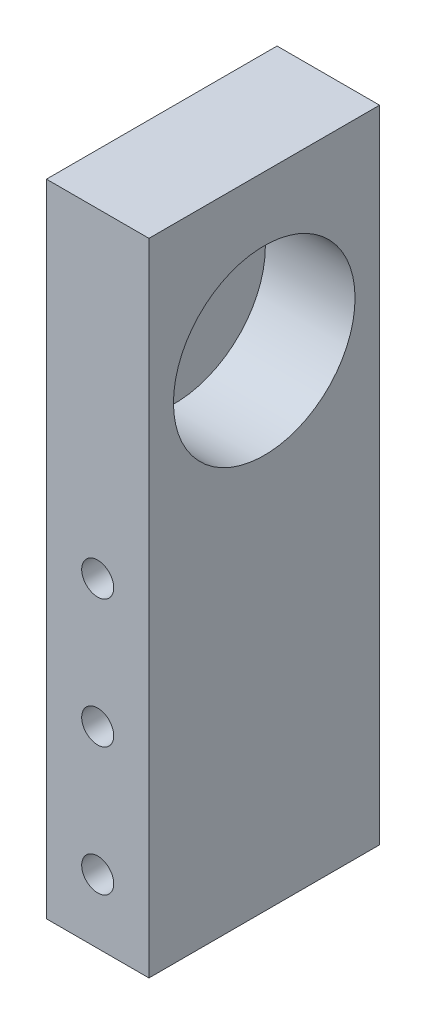
ISO-10303-21;
HEADER;
FILE_DESCRIPTION(('STEP AP214'),'2;1');
FILE_NAME('part.step','',(''),(''),'','','');
FILE_SCHEMA(('AUTOMOTIVE_DESIGN { 1 0 10303 214 1 1 1 1 }'));
ENDSEC;
DATA;
#1=APPLICATION_CONTEXT('core data for automotive mechanical design processes');
#2=APPLICATION_PROTOCOL_DEFINITION('international standard','automotive_design',2000,#1);
#3=PRODUCT_CONTEXT('',#1,'mechanical');
#4=PRODUCT('Part','Part','',(#3));
#5=PRODUCT_RELATED_PRODUCT_CATEGORY('part','',(#4));
#6=PRODUCT_DEFINITION_FORMATION('','',#4);
#7=PRODUCT_DEFINITION_CONTEXT('part definition',#1,'design');
#8=PRODUCT_DEFINITION('design','',#6,#7);
#9=PRODUCT_DEFINITION_SHAPE('','',#8);
#10=(LENGTH_UNIT() NAMED_UNIT(*) SI_UNIT(.MILLI.,.METRE.));
#11=(NAMED_UNIT(*) PLANE_ANGLE_UNIT() SI_UNIT($,.RADIAN.));
#12=(NAMED_UNIT(*) SI_UNIT($,.STERADIAN.) SOLID_ANGLE_UNIT());
#13=UNCERTAINTY_MEASURE_WITH_UNIT(LENGTH_MEASURE(1.E-05),#10,'distance_accuracy_value','');
#14=(GEOMETRIC_REPRESENTATION_CONTEXT(3) GLOBAL_UNCERTAINTY_ASSIGNED_CONTEXT((#13)) GLOBAL_UNIT_ASSIGNED_CONTEXT((#10,
#11,#12)) REPRESENTATION_CONTEXT('',''));
#15=CARTESIAN_POINT('',(0.,0.,0.));
#16=DIRECTION('',(0.,0.,1.));
#17=DIRECTION('',(1.,0.,0.));
#18=AXIS2_PLACEMENT_3D('',#15,#16,#17);
#19=CARTESIAN_POINT('',(0.,0.,22.86));
#20=DIRECTION('',(1.,0.,0.));
#21=DIRECTION('',(0.,0.,-1.));
#22=AXIS2_PLACEMENT_3D('',#19,#20,#21);
#23=PLANE('',#22);
#24=CARTESIAN_POINT('',(0.,96.300036,0.));
#25=DIRECTION('',(1.,0.,0.));
#26=DIRECTION('',(0.,0.,-1.));
#27=AXIS2_PLACEMENT_3D('',#24,#25,#26);
#28=CIRCLE('',#27,2.999994);
#29=CARTESIAN_POINT('',(0.,96.300036,-2.999994));
#30=VERTEX_POINT('',#29);
#31=EDGE_CURVE('E178',#30,#30,#28,.T.);
#32=ORIENTED_EDGE('',*,*,#31,.T.);
#33=EDGE_LOOP('',(#32));
#34=FACE_BOUND('',#33,.T.);
#35=DIRECTION('',(0.,-1.,0.));
#36=VECTOR('',#35,1.);
#37=CARTESIAN_POINT('',(0.,0.,-22.86));
#38=LINE('',#37,#36);
#39=CARTESIAN_POINT('',(0.,127.,-22.86));
#40=VERTEX_POINT('',#39);
#41=CARTESIAN_POINT('',(0.,0.,-22.86));
#42=VERTEX_POINT('',#41);
#43=EDGE_CURVE('E71',#40,#42,#38,.T.);
#44=ORIENTED_EDGE('',*,*,#43,.T.);
#45=DIRECTION('',(0.,0.,-1.));
#46=VECTOR('',#45,1.);
#47=CARTESIAN_POINT('',(0.,0.,22.86));
#48=LINE('',#47,#46);
#49=CARTESIAN_POINT('',(0.,0.,22.86));
#50=VERTEX_POINT('',#49);
#51=EDGE_CURVE('E11',#50,#42,#48,.T.);
#52=ORIENTED_EDGE('',*,*,#51,.F.);
#53=DIRECTION('',(0.,-1.,0.));
#54=VECTOR('',#53,1.);
#55=CARTESIAN_POINT('',(0.,0.,22.86));
#56=LINE('',#55,#54);
#57=CARTESIAN_POINT('',(0.,127.,22.86));
#58=VERTEX_POINT('',#57);
#59=EDGE_CURVE('E83',#58,#50,#56,.T.);
#60=ORIENTED_EDGE('',*,*,#59,.F.);
#61=DIRECTION('',(0.,0.,1.));
#62=VECTOR('',#61,1.);
#63=CARTESIAN_POINT('',(0.,127.,-22.86));
#64=LINE('',#63,#62);
#65=EDGE_CURVE('E86',#40,#58,#64,.T.);
#66=ORIENTED_EDGE('',*,*,#65,.F.);
#67=EDGE_LOOP('',(#44,#52,#60,#66));
#68=FACE_BOUND('',#67,.T.);
#69=ADVANCED_FACE('F39',(#34,#68),#23,.F.);
#70=CARTESIAN_POINT('',(0.,0.,22.86));
#71=DIRECTION('',(0.,1.,0.));
#72=DIRECTION('',(0.,0.,1.));
#73=AXIS2_PLACEMENT_3D('',#70,#71,#72);
#74=PLANE('',#73);
#75=DIRECTION('',(1.,0.,0.));
#76=VECTOR('',#75,1.);
#77=CARTESIAN_POINT('',(0.,0.,-22.86));
#78=LINE('',#77,#76);
#79=CARTESIAN_POINT('',(20.32,0.,-22.86));
#80=VERTEX_POINT('',#79);
#81=EDGE_CURVE('E67',#42,#80,#78,.T.);
#82=ORIENTED_EDGE('',*,*,#81,.T.);
#83=DIRECTION('',(0.,0.,-1.));
#84=VECTOR('',#83,1.);
#85=CARTESIAN_POINT('',(20.32,0.,22.86));
#86=LINE('',#85,#84);
#87=CARTESIAN_POINT('',(20.32,0.,22.86));
#88=VERTEX_POINT('',#87);
#89=EDGE_CURVE('E48',#88,#80,#86,.T.);
#90=ORIENTED_EDGE('',*,*,#89,.F.);
#91=DIRECTION('',(1.,0.,0.));
#92=VECTOR('',#91,1.);
#93=CARTESIAN_POINT('',(0.,0.,22.86));
#94=LINE('',#93,#92);
#95=EDGE_CURVE('E56',#50,#88,#94,.T.);
#96=ORIENTED_EDGE('',*,*,#95,.F.);
#97=ORIENTED_EDGE('',*,*,#51,.T.);
#98=EDGE_LOOP('',(#82,#90,#96,#97));
#99=FACE_BOUND('',#98,.T.);
#100=ADVANCED_FACE('F171',(#99),#74,.F.);
#101=CARTESIAN_POINT('',(20.32,0.,22.86));
#102=DIRECTION('',(-1.,0.,0.));
#103=DIRECTION('',(0.,0.,1.));
#104=AXIS2_PLACEMENT_3D('',#101,#102,#103);
#105=PLANE('',#104);
#106=CARTESIAN_POINT('',(20.32,96.300036,0.));
#107=DIRECTION('',(1.,0.,0.));
#108=DIRECTION('',(0.,0.,-1.));
#109=AXIS2_PLACEMENT_3D('',#106,#107,#108);
#110=CIRCLE('',#109,17.999964);
#111=CARTESIAN_POINT('',(20.32,96.300036,-17.999964));
#112=VERTEX_POINT('',#111);
#113=EDGE_CURVE('E108',#112,#112,#110,.T.);
#114=ORIENTED_EDGE('',*,*,#113,.F.);
#115=EDGE_LOOP('',(#114));
#116=FACE_BOUND('',#115,.T.);
#117=DIRECTION('',(0.,1.,0.));
#118=VECTOR('',#117,1.);
#119=CARTESIAN_POINT('',(20.32,0.,-22.86));
#120=LINE('',#119,#118);
#121=CARTESIAN_POINT('',(20.32,127.,-22.86));
#122=VERTEX_POINT('',#121);
#123=EDGE_CURVE('E88',#80,#122,#120,.T.);
#124=ORIENTED_EDGE('',*,*,#123,.T.);
#125=DIRECTION('',(0.,0.,-1.));
#126=VECTOR('',#125,1.);
#127=CARTESIAN_POINT('',(20.32,127.,-22.86));
#128=LINE('',#127,#126);
#129=CARTESIAN_POINT('',(20.32,127.,22.86));
#130=VERTEX_POINT('',#129);
#131=EDGE_CURVE('E99',#130,#122,#128,.T.);
#132=ORIENTED_EDGE('',*,*,#131,.F.);
#133=DIRECTION('',(0.,1.,0.));
#134=VECTOR('',#133,1.);
#135=CARTESIAN_POINT('',(20.32,0.,22.86));
#136=LINE('',#135,#134);
#137=EDGE_CURVE('E94',#88,#130,#136,.T.);
#138=ORIENTED_EDGE('',*,*,#137,.F.);
#139=ORIENTED_EDGE('',*,*,#89,.T.);
#140=EDGE_LOOP('',(#124,#132,#138,#139));
#141=FACE_BOUND('',#140,.T.);
#142=ADVANCED_FACE('F152',(#116,#141),#105,.F.);
#143=CARTESIAN_POINT('',(0.,0.,22.86));
#144=DIRECTION('',(0.,0.,-1.));
#145=DIRECTION('',(-1.,0.,0.));
#146=AXIS2_PLACEMENT_3D('',#143,#144,#145);
#147=PLANE('',#146);
#148=CARTESIAN_POINT('',(10.16,12.7,22.86));
#149=DIRECTION('',(0.,0.,1.));
#150=DIRECTION('',(1.,0.,0.));
#151=AXIS2_PLACEMENT_3D('',#148,#149,#150);
#152=CIRCLE('',#151,3.175);
#153=CARTESIAN_POINT('',(13.335,12.7,22.86));
#154=VERTEX_POINT('',#153);
#155=EDGE_CURVE('E121',#154,#154,#152,.T.);
#156=ORIENTED_EDGE('',*,*,#155,.F.);
#157=EDGE_LOOP('',(#156));
#158=FACE_BOUND('',#157,.T.);
#159=CARTESIAN_POINT('',(10.16,38.1,22.86));
#160=DIRECTION('',(0.,0.,1.));
#161=DIRECTION('',(1.,0.,0.));
#162=AXIS2_PLACEMENT_3D('',#159,#160,#161);
#163=CIRCLE('',#162,3.175);
#164=CARTESIAN_POINT('',(13.335,38.1,22.86));
#165=VERTEX_POINT('',#164);
#166=EDGE_CURVE('E129',#165,#165,#163,.T.);
#167=ORIENTED_EDGE('',*,*,#166,.F.);
#168=EDGE_LOOP('',(#167));
#169=FACE_BOUND('',#168,.T.);
#170=CARTESIAN_POINT('',(10.16,63.5,22.86));
#171=DIRECTION('',(0.,0.,1.));
#172=DIRECTION('',(1.,0.,0.));
#173=AXIS2_PLACEMENT_3D('',#170,#171,#172);
#174=CIRCLE('',#173,3.175);
#175=CARTESIAN_POINT('',(13.335,63.5,22.86));
#176=VERTEX_POINT('',#175);
#177=EDGE_CURVE('E116',#176,#176,#174,.T.);
#178=ORIENTED_EDGE('',*,*,#177,.F.);
#179=EDGE_LOOP('',(#178));
#180=FACE_BOUND('',#179,.T.);
#181=ORIENTED_EDGE('',*,*,#59,.T.);
#182=ORIENTED_EDGE('',*,*,#95,.T.);
#183=ORIENTED_EDGE('',*,*,#137,.T.);
#184=DIRECTION('',(1.,0.,0.));
#185=VECTOR('',#184,1.);
#186=CARTESIAN_POINT('',(0.,127.,22.86));
#187=LINE('',#186,#185);
#188=EDGE_CURVE('E91',#58,#130,#187,.T.);
#189=ORIENTED_EDGE('',*,*,#188,.F.);
#190=EDGE_LOOP('',(#181,#182,#183,#189));
#191=FACE_BOUND('',#190,.T.);
#192=ADVANCED_FACE('F92',(#158,#169,#180,#191),#147,.F.);
#193=CARTESIAN_POINT('',(0.,0.,-22.86));
#194=DIRECTION('',(0.,0.,-1.));
#195=DIRECTION('',(-1.,0.,0.));
#196=AXIS2_PLACEMENT_3D('',#193,#194,#195);
#197=PLANE('',#196);
#198=CARTESIAN_POINT('',(10.16,12.7,-22.86));
#199=DIRECTION('',(0.,0.,1.));
#200=DIRECTION('',(1.,0.,0.));
#201=AXIS2_PLACEMENT_3D('',#198,#199,#200);
#202=CIRCLE('',#201,3.175);
#203=CARTESIAN_POINT('',(13.335,12.7,-22.86));
#204=VERTEX_POINT('',#203);
#205=EDGE_CURVE('E117',#204,#204,#202,.T.);
#206=ORIENTED_EDGE('',*,*,#205,.T.);
#207=EDGE_LOOP('',(#206));
#208=FACE_BOUND('',#207,.T.);
#209=CARTESIAN_POINT('',(10.16,38.1,-22.86));
#210=DIRECTION('',(0.,0.,1.));
#211=DIRECTION('',(1.,0.,0.));
#212=AXIS2_PLACEMENT_3D('',#209,#210,#211);
#213=CIRCLE('',#212,3.175);
#214=CARTESIAN_POINT('',(13.335,38.1,-22.86));
#215=VERTEX_POINT('',#214);
#216=EDGE_CURVE('E125',#215,#215,#213,.T.);
#217=ORIENTED_EDGE('',*,*,#216,.T.);
#218=EDGE_LOOP('',(#217));
#219=FACE_BOUND('',#218,.T.);
#220=CARTESIAN_POINT('',(10.16,63.5,-22.86));
#221=DIRECTION('',(0.,0.,1.));
#222=DIRECTION('',(1.,0.,0.));
#223=AXIS2_PLACEMENT_3D('',#220,#221,#222);
#224=CIRCLE('',#223,3.175);
#225=CARTESIAN_POINT('',(13.335,63.5,-22.86));
#226=VERTEX_POINT('',#225);
#227=EDGE_CURVE('E133',#226,#226,#224,.T.);
#228=ORIENTED_EDGE('',*,*,#227,.T.);
#229=EDGE_LOOP('',(#228));
#230=FACE_BOUND('',#229,.T.);
#231=ORIENTED_EDGE('',*,*,#43,.F.);
#232=DIRECTION('',(-1.,0.,0.));
#233=VECTOR('',#232,1.);
#234=CARTESIAN_POINT('',(0.,127.,-22.86));
#235=LINE('',#234,#233);
#236=EDGE_CURVE('E102',#122,#40,#235,.T.);
#237=ORIENTED_EDGE('',*,*,#236,.F.);
#238=ORIENTED_EDGE('',*,*,#123,.F.);
#239=ORIENTED_EDGE('',*,*,#81,.F.);
#240=EDGE_LOOP('',(#231,#237,#238,#239));
#241=FACE_BOUND('',#240,.T.);
#242=ADVANCED_FACE('F154',(#208,#219,#230,#241),#197,.T.);
#243=CARTESIAN_POINT('',(10.16,63.5,-22.86));
#244=DIRECTION('',(0.,0.,1.));
#245=DIRECTION('',(1.,0.,0.));
#246=AXIS2_PLACEMENT_3D('',#243,#244,#245);
#247=CYLINDRICAL_SURFACE('',#246,3.175);
#248=ORIENTED_EDGE('',*,*,#227,.F.);
#249=EDGE_LOOP('',(#248));
#250=FACE_BOUND('',#249,.T.);
#251=ORIENTED_EDGE('',*,*,#177,.T.);
#252=EDGE_LOOP('',(#251));
#253=FACE_BOUND('',#252,.T.);
#254=ADVANCED_FACE('F156',(#250,#253),#247,.F.);
#255=CARTESIAN_POINT('',(10.16,38.1,-22.86));
#256=DIRECTION('',(0.,0.,1.));
#257=DIRECTION('',(1.,0.,0.));
#258=AXIS2_PLACEMENT_3D('',#255,#256,#257);
#259=CYLINDRICAL_SURFACE('',#258,3.175);
#260=ORIENTED_EDGE('',*,*,#216,.F.);
#261=EDGE_LOOP('',(#260));
#262=FACE_BOUND('',#261,.T.);
#263=ORIENTED_EDGE('',*,*,#166,.T.);
#264=EDGE_LOOP('',(#263));
#265=FACE_BOUND('',#264,.T.);
#266=ADVANCED_FACE('F163',(#262,#265),#259,.F.);
#267=CARTESIAN_POINT('',(10.16,12.7,-22.86));
#268=DIRECTION('',(0.,0.,1.));
#269=DIRECTION('',(1.,0.,0.));
#270=AXIS2_PLACEMENT_3D('',#267,#268,#269);
#271=CYLINDRICAL_SURFACE('',#270,3.175);
#272=ORIENTED_EDGE('',*,*,#205,.F.);
#273=EDGE_LOOP('',(#272));
#274=FACE_BOUND('',#273,.T.);
#275=ORIENTED_EDGE('',*,*,#155,.T.);
#276=EDGE_LOOP('',(#275));
#277=FACE_BOUND('',#276,.T.);
#278=ADVANCED_FACE('F222',(#274,#277),#271,.F.);
#279=CARTESIAN_POINT('',(0.,127.,0.));
#280=DIRECTION('',(0.,1.,0.));
#281=DIRECTION('',(0.,0.,1.));
#282=AXIS2_PLACEMENT_3D('',#279,#280,#281);
#283=PLANE('',#282);
#284=ORIENTED_EDGE('',*,*,#65,.T.);
#285=ORIENTED_EDGE('',*,*,#188,.T.);
#286=ORIENTED_EDGE('',*,*,#131,.T.);
#287=ORIENTED_EDGE('',*,*,#236,.T.);
#288=EDGE_LOOP('',(#284,#285,#286,#287));
#289=FACE_BOUND('',#288,.T.);
#290=ADVANCED_FACE('F101',(#289),#283,.T.);
#291=CARTESIAN_POINT('',(2.54,96.300036,0.));
#292=DIRECTION('',(1.,0.,0.));
#293=DIRECTION('',(0.,0.,-1.));
#294=AXIS2_PLACEMENT_3D('',#291,#292,#293);
#295=CYLINDRICAL_SURFACE('',#294,17.999964);
#296=CARTESIAN_POINT('',(2.54,96.300036,0.));
#297=DIRECTION('',(1.,0.,0.));
#298=DIRECTION('',(0.,0.,-1.));
#299=AXIS2_PLACEMENT_3D('',#296,#297,#298);
#300=CIRCLE('',#299,17.999964);
#301=CARTESIAN_POINT('',(2.54,96.300036,-17.999964));
#302=VERTEX_POINT('',#301);
#303=EDGE_CURVE('E104',#302,#302,#300,.T.);
#304=ORIENTED_EDGE('',*,*,#303,.F.);
#305=EDGE_LOOP('',(#304));
#306=FACE_BOUND('',#305,.T.);
#307=ORIENTED_EDGE('',*,*,#113,.T.);
#308=EDGE_LOOP('',(#307));
#309=FACE_BOUND('',#308,.T.);
#310=ADVANCED_FACE('F195',(#306,#309),#295,.F.);
#311=CARTESIAN_POINT('',(2.54,96.300036,0.));
#312=DIRECTION('',(1.,0.,0.));
#313=DIRECTION('',(0.,0.,-1.));
#314=AXIS2_PLACEMENT_3D('',#311,#312,#313);
#315=PLANE('',#314);
#316=CARTESIAN_POINT('',(2.54,96.300036,0.));
#317=DIRECTION('',(1.,0.,0.));
#318=DIRECTION('',(0.,0.,-1.));
#319=AXIS2_PLACEMENT_3D('',#316,#317,#318);
#320=CIRCLE('',#319,2.999994);
#321=CARTESIAN_POINT('',(2.54,96.300036,-2.999994));
#322=VERTEX_POINT('',#321);
#323=EDGE_CURVE('E181',#322,#322,#320,.T.);
#324=ORIENTED_EDGE('',*,*,#323,.F.);
#325=EDGE_LOOP('',(#324));
#326=FACE_BOUND('',#325,.T.);
#327=ORIENTED_EDGE('',*,*,#303,.T.);
#328=EDGE_LOOP('',(#327));
#329=FACE_BOUND('',#328,.T.);
#330=ADVANCED_FACE('F192',(#326,#329),#315,.T.);
#331=CARTESIAN_POINT('',(0.,96.300036,0.));
#332=DIRECTION('',(1.,0.,0.));
#333=DIRECTION('',(0.,0.,-1.));
#334=AXIS2_PLACEMENT_3D('',#331,#332,#333);
#335=CYLINDRICAL_SURFACE('',#334,2.999994);
#336=ORIENTED_EDGE('',*,*,#31,.F.);
#337=EDGE_LOOP('',(#336));
#338=FACE_BOUND('',#337,.T.);
#339=ORIENTED_EDGE('',*,*,#323,.T.);
#340=EDGE_LOOP('',(#339));
#341=FACE_BOUND('',#340,.T.);
#342=ADVANCED_FACE('F190',(#338,#341),#335,.F.);
#343=CLOSED_SHELL('',(#69,#100,#142,#192,#242,#254,#266,#278,#290,#310,#330,#342));
#344=MANIFOLD_SOLID_BREP('B2',#343);
#345=ADVANCED_BREP_SHAPE_REPRESENTATION('',(#18,#344),#14);
#346=SHAPE_DEFINITION_REPRESENTATION(#9,#345);
ENDSEC;
END-ISO-10303-21;
